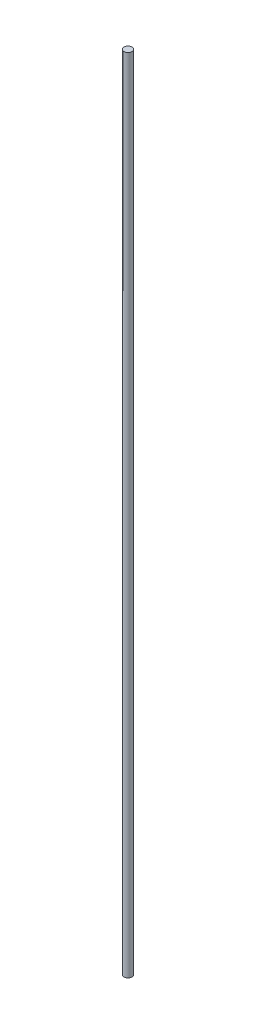
ISO-10303-21;
HEADER;
FILE_DESCRIPTION(('STEP AP214'),'2;1');
FILE_NAME('part.step','',(''),(''),'','','');
FILE_SCHEMA(('AUTOMOTIVE_DESIGN { 1 0 10303 214 1 1 1 1 }'));
ENDSEC;
DATA;
#1=APPLICATION_CONTEXT('core data for automotive mechanical design processes');
#2=APPLICATION_PROTOCOL_DEFINITION('international standard','automotive_design',2000,#1);
#3=PRODUCT_CONTEXT('',#1,'mechanical');
#4=PRODUCT('Part','Part','',(#3));
#5=PRODUCT_RELATED_PRODUCT_CATEGORY('part','',(#4));
#6=PRODUCT_DEFINITION_FORMATION('','',#4);
#7=PRODUCT_DEFINITION_CONTEXT('part definition',#1,'design');
#8=PRODUCT_DEFINITION('design','',#6,#7);
#9=PRODUCT_DEFINITION_SHAPE('','',#8);
#10=(LENGTH_UNIT() NAMED_UNIT(*) SI_UNIT(.MILLI.,.METRE.));
#11=(NAMED_UNIT(*) PLANE_ANGLE_UNIT() SI_UNIT($,.RADIAN.));
#12=(NAMED_UNIT(*) SI_UNIT($,.STERADIAN.) SOLID_ANGLE_UNIT());
#13=UNCERTAINTY_MEASURE_WITH_UNIT(LENGTH_MEASURE(1.E-05),#10,'distance_accuracy_value','');
#14=(GEOMETRIC_REPRESENTATION_CONTEXT(3) GLOBAL_UNCERTAINTY_ASSIGNED_CONTEXT((#13)) GLOBAL_UNIT_ASSIGNED_CONTEXT((#10,
#11,#12)) REPRESENTATION_CONTEXT('',''));
#15=CARTESIAN_POINT('',(0.,0.,0.));
#16=DIRECTION('',(0.,0.,1.));
#17=DIRECTION('',(1.,0.,0.));
#18=AXIS2_PLACEMENT_3D('',#15,#16,#17);
#19=CARTESIAN_POINT('',(0.,-150.,0.));
#20=DIRECTION('',(0.,1.,0.));
#21=DIRECTION('',(0.,0.,1.));
#22=AXIS2_PLACEMENT_3D('',#19,#20,#21);
#23=PLANE('',#22);
#24=CARTESIAN_POINT('',(0.,-150.,0.));
#25=DIRECTION('',(0.,1.,0.));
#26=DIRECTION('',(0.,0.,1.));
#27=AXIS2_PLACEMENT_3D('',#24,#25,#26);
#28=CIRCLE('',#27,0.75);
#29=CARTESIAN_POINT('',(0.,-150.,0.749999999999982));
#30=VERTEX_POINT('',#29);
#31=EDGE_CURVE('E24',#30,#30,#28,.T.);
#32=ORIENTED_EDGE('',*,*,#31,.F.);
#33=EDGE_LOOP('',(#32));
#34=FACE_BOUND('',#33,.T.);
#35=ADVANCED_FACE('F17',(#34),#23,.F.);
#36=CARTESIAN_POINT('',(0.,0.,0.));
#37=DIRECTION('',(0.,1.,0.));
#38=DIRECTION('',(0.,0.,1.));
#39=AXIS2_PLACEMENT_3D('',#36,#37,#38);
#40=PLANE('',#39);
#41=CARTESIAN_POINT('',(0.,0.,0.));
#42=DIRECTION('',(0.,1.,0.));
#43=DIRECTION('',(0.,0.,1.));
#44=AXIS2_PLACEMENT_3D('',#41,#42,#43);
#45=CIRCLE('',#44,0.75);
#46=CARTESIAN_POINT('',(0.,0.,0.75));
#47=VERTEX_POINT('',#46);
#48=EDGE_CURVE('E11',#47,#47,#45,.T.);
#49=ORIENTED_EDGE('',*,*,#48,.T.);
#50=EDGE_LOOP('',(#49));
#51=FACE_BOUND('',#50,.T.);
#52=ADVANCED_FACE('F31',(#51),#40,.T.);
#53=CARTESIAN_POINT('',(0.,-150.,0.));
#54=DIRECTION('',(0.,1.,0.));
#55=DIRECTION('',(0.,0.,1.));
#56=AXIS2_PLACEMENT_3D('',#53,#54,#55);
#57=CYLINDRICAL_SURFACE('',#56,0.75);
#58=ORIENTED_EDGE('',*,*,#48,.F.);
#59=EDGE_LOOP('',(#58));
#60=FACE_BOUND('',#59,.T.);
#61=ORIENTED_EDGE('',*,*,#31,.T.);
#62=EDGE_LOOP('',(#61));
#63=FACE_BOUND('',#62,.T.);
#64=ADVANCED_FACE('F33',(#60,#63),#57,.T.);
#65=CLOSED_SHELL('',(#35,#52,#64));
#66=MANIFOLD_SOLID_BREP('B1',#65);
#67=ADVANCED_BREP_SHAPE_REPRESENTATION('',(#18,#66),#14);
#68=SHAPE_DEFINITION_REPRESENTATION(#9,#67);
ENDSEC;
END-ISO-10303-21;
